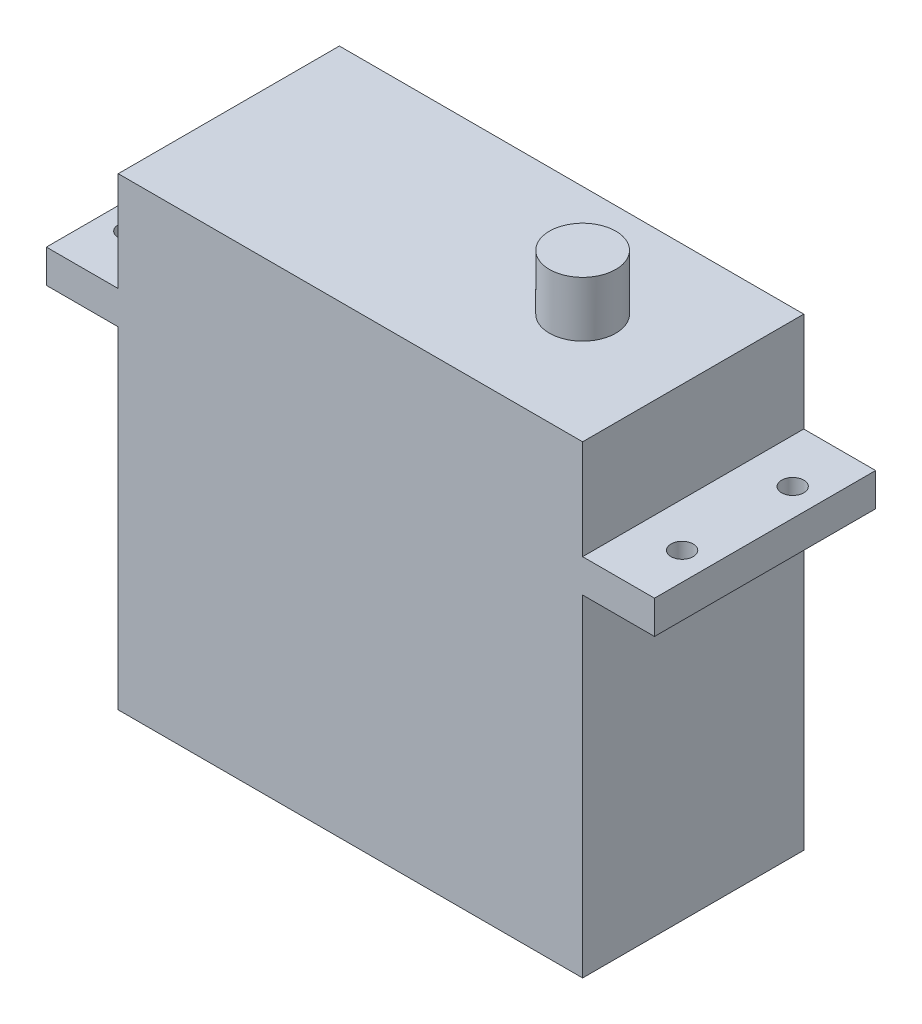
ISO-10303-21;
HEADER;
FILE_DESCRIPTION(('STEP AP214'),'2;1');
FILE_NAME('part.step','',(''),(''),'','','');
FILE_SCHEMA(('AUTOMOTIVE_DESIGN { 1 0 10303 214 1 1 1 1 }'));
ENDSEC;
DATA;
#1=APPLICATION_CONTEXT('core data for automotive mechanical design processes');
#2=APPLICATION_PROTOCOL_DEFINITION('international standard','automotive_design',2000,#1);
#3=PRODUCT_CONTEXT('',#1,'mechanical');
#4=PRODUCT('Part','Part','',(#3));
#5=PRODUCT_RELATED_PRODUCT_CATEGORY('part','',(#4));
#6=PRODUCT_DEFINITION_FORMATION('','',#4);
#7=PRODUCT_DEFINITION_CONTEXT('part definition',#1,'design');
#8=PRODUCT_DEFINITION('design','',#6,#7);
#9=PRODUCT_DEFINITION_SHAPE('','',#8);
#10=(LENGTH_UNIT() NAMED_UNIT(*) SI_UNIT(.MILLI.,.METRE.));
#11=(NAMED_UNIT(*) PLANE_ANGLE_UNIT() SI_UNIT($,.RADIAN.));
#12=(NAMED_UNIT(*) SI_UNIT($,.STERADIAN.) SOLID_ANGLE_UNIT());
#13=UNCERTAINTY_MEASURE_WITH_UNIT(LENGTH_MEASURE(1.E-05),#10,'distance_accuracy_value','');
#14=(GEOMETRIC_REPRESENTATION_CONTEXT(3) GLOBAL_UNCERTAINTY_ASSIGNED_CONTEXT((#13)) GLOBAL_UNIT_ASSIGNED_CONTEXT((#10,
#11,#12)) REPRESENTATION_CONTEXT('',''));
#15=CARTESIAN_POINT('',(0.,0.,0.));
#16=DIRECTION('',(0.,0.,1.));
#17=DIRECTION('',(1.,0.,0.));
#18=AXIS2_PLACEMENT_3D('',#15,#16,#17);
#19=CARTESIAN_POINT('',(0.,42.,-20.));
#20=DIRECTION('',(0.,-1.,0.));
#21=DIRECTION('',(0.,0.,-1.));
#22=AXIS2_PLACEMENT_3D('',#19,#20,#21);
#23=PLANE('',#22);
#24=DIRECTION('',(0.,0.,1.));
#25=VECTOR('',#24,1.);
#26=CARTESIAN_POINT('',(0.,42.,0.));
#27=LINE('',#26,#25);
#28=CARTESIAN_POINT('',(0.,42.,-20.));
#29=VERTEX_POINT('',#28);
#30=CARTESIAN_POINT('',(0.,42.,0.));
#31=VERTEX_POINT('',#30);
#32=EDGE_CURVE('E182',#29,#31,#27,.T.);
#33=ORIENTED_EDGE('',*,*,#32,.T.);
#34=DIRECTION('',(1.,0.,0.));
#35=VECTOR('',#34,1.);
#36=CARTESIAN_POINT('',(0.,42.,0.));
#37=LINE('',#36,#35);
#38=CARTESIAN_POINT('',(42.,42.,0.));
#39=VERTEX_POINT('',#38);
#40=EDGE_CURVE('E185',#31,#39,#37,.T.);
#41=ORIENTED_EDGE('',*,*,#40,.T.);
#42=DIRECTION('',(0.,0.,-1.));
#43=VECTOR('',#42,1.);
#44=CARTESIAN_POINT('',(42.,42.,0.));
#45=LINE('',#44,#43);
#46=CARTESIAN_POINT('',(42.,42.,-20.));
#47=VERTEX_POINT('',#46);
#48=EDGE_CURVE('E188',#39,#47,#45,.T.);
#49=ORIENTED_EDGE('',*,*,#48,.T.);
#50=DIRECTION('',(-1.,0.,0.));
#51=VECTOR('',#50,1.);
#52=CARTESIAN_POINT('',(0.,42.,-20.));
#53=LINE('',#52,#51);
#54=EDGE_CURVE('E190',#47,#29,#53,.T.);
#55=ORIENTED_EDGE('',*,*,#54,.T.);
#56=EDGE_LOOP('',(#33,#41,#49,#55));
#57=FACE_BOUND('',#56,.T.);
#58=CARTESIAN_POINT('',(32.,42.,-10.));
#59=DIRECTION('',(0.,-1.,0.));
#60=DIRECTION('',(0.,0.,-1.));
#61=AXIS2_PLACEMENT_3D('',#58,#59,#60);
#62=CIRCLE('',#61,3.);
#63=CARTESIAN_POINT('',(32.,42.,-13.));
#64=VERTEX_POINT('',#63);
#65=EDGE_CURVE('E11',#64,#64,#62,.F.);
#66=ORIENTED_EDGE('',*,*,#65,.F.);
#67=EDGE_LOOP('',(#66));
#68=FACE_BOUND('',#67,.T.);
#69=ADVANCED_FACE('F34',(#57,#68),#23,.F.);
#70=CARTESIAN_POINT('',(0.,42.,0.));
#71=DIRECTION('',(1.,0.,0.));
#72=DIRECTION('',(0.,0.,-1.));
#73=AXIS2_PLACEMENT_3D('',#70,#71,#72);
#74=PLANE('',#73);
#75=DIRECTION('',(0.,-1.,0.));
#76=VECTOR('',#75,1.);
#77=CARTESIAN_POINT('',(0.,42.,-20.));
#78=LINE('',#77,#76);
#79=CARTESIAN_POINT('',(0.,33.,-20.));
#80=VERTEX_POINT('',#79);
#81=EDGE_CURVE('E202',#29,#80,#78,.T.);
#82=ORIENTED_EDGE('',*,*,#81,.T.);
#83=DIRECTION('',(0.,0.,1.));
#84=VECTOR('',#83,1.);
#85=CARTESIAN_POINT('',(0.,33.,0.));
#86=LINE('',#85,#84);
#87=CARTESIAN_POINT('',(0.,33.,0.));
#88=VERTEX_POINT('',#87);
#89=EDGE_CURVE('E57',#80,#88,#86,.T.);
#90=ORIENTED_EDGE('',*,*,#89,.T.);
#91=DIRECTION('',(0.,-1.,0.));
#92=VECTOR('',#91,1.);
#93=CARTESIAN_POINT('',(0.,42.,0.));
#94=LINE('',#93,#92);
#95=EDGE_CURVE('E42',#31,#88,#94,.T.);
#96=ORIENTED_EDGE('',*,*,#95,.F.);
#97=ORIENTED_EDGE('',*,*,#32,.F.);
#98=EDGE_LOOP('',(#82,#90,#96,#97));
#99=FACE_BOUND('',#98,.T.);
#100=ADVANCED_FACE('F272',(#99),#74,.F.);
#101=CARTESIAN_POINT('',(42.,42.,0.));
#102=DIRECTION('',(-1.,0.,0.));
#103=DIRECTION('',(0.,0.,1.));
#104=AXIS2_PLACEMENT_3D('',#101,#102,#103);
#105=PLANE('',#104);
#106=DIRECTION('',(0.,-1.,0.));
#107=VECTOR('',#106,1.);
#108=CARTESIAN_POINT('',(42.,42.,0.));
#109=LINE('',#108,#107);
#110=CARTESIAN_POINT('',(42.,33.,0.));
#111=VERTEX_POINT('',#110);
#112=EDGE_CURVE('E209',#39,#111,#109,.T.);
#113=ORIENTED_EDGE('',*,*,#112,.T.);
#114=DIRECTION('',(0.,0.,-1.));
#115=VECTOR('',#114,1.);
#116=CARTESIAN_POINT('',(42.,33.,0.));
#117=LINE('',#116,#115);
#118=CARTESIAN_POINT('',(42.,33.,-20.));
#119=VERTEX_POINT('',#118);
#120=EDGE_CURVE('E177',#111,#119,#117,.T.);
#121=ORIENTED_EDGE('',*,*,#120,.T.);
#122=DIRECTION('',(0.,-1.,0.));
#123=VECTOR('',#122,1.);
#124=CARTESIAN_POINT('',(42.,42.,-20.));
#125=LINE('',#124,#123);
#126=EDGE_CURVE('E205',#47,#119,#125,.T.);
#127=ORIENTED_EDGE('',*,*,#126,.F.);
#128=ORIENTED_EDGE('',*,*,#48,.F.);
#129=EDGE_LOOP('',(#113,#121,#127,#128));
#130=FACE_BOUND('',#129,.T.);
#131=ADVANCED_FACE('F251',(#130),#105,.F.);
#132=CARTESIAN_POINT('',(0.,30.,0.));
#133=VERTEX_POINT('',#132);
#134=CARTESIAN_POINT('',(0.,0.,0.));
#135=VERTEX_POINT('',#134);
#136=EDGE_CURVE('E49',#133,#135,#94,.T.);
#137=ORIENTED_EDGE('',*,*,#136,.F.);
#138=DIRECTION('',(0.,0.,-1.));
#139=VECTOR('',#138,1.);
#140=CARTESIAN_POINT('',(0.,30.,0.));
#141=LINE('',#140,#139);
#142=CARTESIAN_POINT('',(0.,30.,-20.));
#143=VERTEX_POINT('',#142);
#144=EDGE_CURVE('E141',#133,#143,#141,.T.);
#145=ORIENTED_EDGE('',*,*,#144,.T.);
#146=CARTESIAN_POINT('',(0.,0.,-20.));
#147=VERTEX_POINT('',#146);
#148=EDGE_CURVE('E192',#143,#147,#78,.T.);
#149=ORIENTED_EDGE('',*,*,#148,.T.);
#150=DIRECTION('',(0.,0.,1.));
#151=VECTOR('',#150,1.);
#152=CARTESIAN_POINT('',(0.,0.,0.));
#153=LINE('',#152,#151);
#154=EDGE_CURVE('E181',#147,#135,#153,.T.);
#155=ORIENTED_EDGE('',*,*,#154,.T.);
#156=EDGE_LOOP('',(#137,#145,#149,#155));
#157=FACE_BOUND('',#156,.T.);
#158=ADVANCED_FACE('F36',(#157),#74,.F.);
#159=CARTESIAN_POINT('',(0.,42.,0.));
#160=DIRECTION('',(0.,0.,-1.));
#161=DIRECTION('',(-1.,0.,0.));
#162=AXIS2_PLACEMENT_3D('',#159,#160,#161);
#163=PLANE('',#162);
#164=CARTESIAN_POINT('',(42.,30.,0.));
#165=VERTEX_POINT('',#164);
#166=CARTESIAN_POINT('',(42.,0.,0.));
#167=VERTEX_POINT('',#166);
#168=EDGE_CURVE('E208',#165,#167,#109,.T.);
#169=ORIENTED_EDGE('',*,*,#168,.F.);
#170=DIRECTION('',(1.,0.,0.));
#171=VECTOR('',#170,1.);
#172=CARTESIAN_POINT('',(-6.5,30.,0.));
#173=LINE('',#172,#171);
#174=CARTESIAN_POINT('',(48.5,30.,0.));
#175=VERTEX_POINT('',#174);
#176=EDGE_CURVE('E144',#165,#175,#173,.T.);
#177=ORIENTED_EDGE('',*,*,#176,.T.);
#178=DIRECTION('',(0.,1.,0.));
#179=VECTOR('',#178,1.);
#180=CARTESIAN_POINT('',(48.5,30.,0.));
#181=LINE('',#180,#179);
#182=CARTESIAN_POINT('',(48.5,33.,0.));
#183=VERTEX_POINT('',#182);
#184=EDGE_CURVE('E143',#175,#183,#181,.T.);
#185=ORIENTED_EDGE('',*,*,#184,.T.);
#186=DIRECTION('',(-1.,0.,0.));
#187=VECTOR('',#186,1.);
#188=CARTESIAN_POINT('',(-6.5,33.,0.));
#189=LINE('',#188,#187);
#190=EDGE_CURVE('E136',#183,#111,#189,.T.);
#191=ORIENTED_EDGE('',*,*,#190,.T.);
#192=ORIENTED_EDGE('',*,*,#112,.F.);
#193=ORIENTED_EDGE('',*,*,#40,.F.);
#194=ORIENTED_EDGE('',*,*,#95,.T.);
#195=CARTESIAN_POINT('',(-6.5,33.,0.));
#196=VERTEX_POINT('',#195);
#197=EDGE_CURVE('E149',#88,#196,#189,.T.);
#198=ORIENTED_EDGE('',*,*,#197,.T.);
#199=DIRECTION('',(0.,-1.,0.));
#200=VECTOR('',#199,1.);
#201=CARTESIAN_POINT('',(-6.5,30.,0.));
#202=LINE('',#201,#200);
#203=CARTESIAN_POINT('',(-6.5,30.,0.));
#204=VERTEX_POINT('',#203);
#205=EDGE_CURVE('E131',#196,#204,#202,.T.);
#206=ORIENTED_EDGE('',*,*,#205,.T.);
#207=EDGE_CURVE('E139',#204,#133,#173,.T.);
#208=ORIENTED_EDGE('',*,*,#207,.T.);
#209=ORIENTED_EDGE('',*,*,#136,.T.);
#210=DIRECTION('',(1.,0.,0.));
#211=VECTOR('',#210,1.);
#212=CARTESIAN_POINT('',(0.,0.,0.));
#213=LINE('',#212,#211);
#214=EDGE_CURVE('E194',#135,#167,#213,.T.);
#215=ORIENTED_EDGE('',*,*,#214,.T.);
#216=EDGE_LOOP('',(#169,#177,#185,#191,#192,#193,#194,#198,#206,#208,#209,#215));
#217=FACE_BOUND('',#216,.T.);
#218=ADVANCED_FACE('F147',(#217),#163,.F.);
#219=CARTESIAN_POINT('',(42.,30.,-20.));
#220=VERTEX_POINT('',#219);
#221=CARTESIAN_POINT('',(42.,0.,-20.));
#222=VERTEX_POINT('',#221);
#223=EDGE_CURVE('E204',#220,#222,#125,.T.);
#224=ORIENTED_EDGE('',*,*,#223,.F.);
#225=DIRECTION('',(0.,0.,1.));
#226=VECTOR('',#225,1.);
#227=CARTESIAN_POINT('',(42.,30.,0.));
#228=LINE('',#227,#226);
#229=EDGE_CURVE('E172',#220,#165,#228,.T.);
#230=ORIENTED_EDGE('',*,*,#229,.T.);
#231=ORIENTED_EDGE('',*,*,#168,.T.);
#232=DIRECTION('',(0.,0.,-1.));
#233=VECTOR('',#232,1.);
#234=CARTESIAN_POINT('',(42.,0.,0.));
#235=LINE('',#234,#233);
#236=EDGE_CURVE('E197',#167,#222,#235,.T.);
#237=ORIENTED_EDGE('',*,*,#236,.T.);
#238=EDGE_LOOP('',(#224,#230,#231,#237));
#239=FACE_BOUND('',#238,.T.);
#240=ADVANCED_FACE('F285',(#239),#105,.F.);
#241=CARTESIAN_POINT('',(0.,42.,-20.));
#242=DIRECTION('',(0.,0.,1.));
#243=DIRECTION('',(1.,0.,0.));
#244=AXIS2_PLACEMENT_3D('',#241,#242,#243);
#245=PLANE('',#244);
#246=ORIENTED_EDGE('',*,*,#148,.F.);
#247=DIRECTION('',(-1.,0.,0.));
#248=VECTOR('',#247,1.);
#249=CARTESIAN_POINT('',(-6.5,30.,-20.));
#250=LINE('',#249,#248);
#251=CARTESIAN_POINT('',(-6.5,30.,-20.));
#252=VERTEX_POINT('',#251);
#253=EDGE_CURVE('E173',#143,#252,#250,.T.);
#254=ORIENTED_EDGE('',*,*,#253,.T.);
#255=DIRECTION('',(0.,1.,0.));
#256=VECTOR('',#255,1.);
#257=CARTESIAN_POINT('',(-6.5,30.,-20.));
#258=LINE('',#257,#256);
#259=CARTESIAN_POINT('',(-6.5,33.,-20.));
#260=VERTEX_POINT('',#259);
#261=EDGE_CURVE('E132',#252,#260,#258,.T.);
#262=ORIENTED_EDGE('',*,*,#261,.T.);
#263=DIRECTION('',(1.,0.,0.));
#264=VECTOR('',#263,1.);
#265=CARTESIAN_POINT('',(-6.5,33.,-20.));
#266=LINE('',#265,#264);
#267=EDGE_CURVE('E230',#260,#80,#266,.T.);
#268=ORIENTED_EDGE('',*,*,#267,.T.);
#269=ORIENTED_EDGE('',*,*,#81,.F.);
#270=ORIENTED_EDGE('',*,*,#54,.F.);
#271=ORIENTED_EDGE('',*,*,#126,.T.);
#272=CARTESIAN_POINT('',(48.5,33.,-20.));
#273=VERTEX_POINT('',#272);
#274=EDGE_CURVE('E229',#119,#273,#266,.T.);
#275=ORIENTED_EDGE('',*,*,#274,.T.);
#276=DIRECTION('',(0.,-1.,0.));
#277=VECTOR('',#276,1.);
#278=CARTESIAN_POINT('',(48.5,30.,-20.));
#279=LINE('',#278,#277);
#280=CARTESIAN_POINT('',(48.5,30.,-20.));
#281=VERTEX_POINT('',#280);
#282=EDGE_CURVE('E165',#273,#281,#279,.T.);
#283=ORIENTED_EDGE('',*,*,#282,.T.);
#284=EDGE_CURVE('E170',#281,#220,#250,.T.);
#285=ORIENTED_EDGE('',*,*,#284,.T.);
#286=ORIENTED_EDGE('',*,*,#223,.T.);
#287=DIRECTION('',(-1.,0.,0.));
#288=VECTOR('',#287,1.);
#289=CARTESIAN_POINT('',(0.,0.,-20.));
#290=LINE('',#289,#288);
#291=EDGE_CURVE('E186',#222,#147,#290,.T.);
#292=ORIENTED_EDGE('',*,*,#291,.T.);
#293=EDGE_LOOP('',(#246,#254,#262,#268,#269,#270,#271,#275,#283,#285,#286,#292));
#294=FACE_BOUND('',#293,.T.);
#295=ADVANCED_FACE('F236',(#294),#245,.F.);
#296=CARTESIAN_POINT('',(0.,0.,-20.));
#297=DIRECTION('',(0.,-1.,0.));
#298=DIRECTION('',(0.,0.,-1.));
#299=AXIS2_PLACEMENT_3D('',#296,#297,#298);
#300=PLANE('',#299);
#301=ORIENTED_EDGE('',*,*,#154,.F.);
#302=ORIENTED_EDGE('',*,*,#291,.F.);
#303=ORIENTED_EDGE('',*,*,#236,.F.);
#304=ORIENTED_EDGE('',*,*,#214,.F.);
#305=EDGE_LOOP('',(#301,#302,#303,#304));
#306=FACE_BOUND('',#305,.T.);
#307=ADVANCED_FACE('F279',(#306),#300,.T.);
#308=CARTESIAN_POINT('',(48.5,30.,-75.0817574156816));
#309=DIRECTION('',(1.,0.,0.));
#310=DIRECTION('',(0.,0.,-1.));
#311=AXIS2_PLACEMENT_3D('',#308,#309,#310);
#312=PLANE('',#311);
#313=ORIENTED_EDGE('',*,*,#282,.F.);
#314=DIRECTION('',(0.,0.,1.));
#315=VECTOR('',#314,1.);
#316=CARTESIAN_POINT('',(48.5,33.,-75.0817574156816));
#317=LINE('',#316,#315);
#318=EDGE_CURVE('E166',#273,#183,#317,.T.);
#319=ORIENTED_EDGE('',*,*,#318,.T.);
#320=ORIENTED_EDGE('',*,*,#184,.F.);
#321=DIRECTION('',(0.,0.,1.));
#322=VECTOR('',#321,1.);
#323=CARTESIAN_POINT('',(48.5,30.,-75.0817574156816));
#324=LINE('',#323,#322);
#325=EDGE_CURVE('E135',#281,#175,#324,.T.);
#326=ORIENTED_EDGE('',*,*,#325,.F.);
#327=EDGE_LOOP('',(#313,#319,#320,#326));
#328=FACE_BOUND('',#327,.T.);
#329=ADVANCED_FACE('F243',(#328),#312,.T.);
#330=CARTESIAN_POINT('',(-6.5,30.,-75.0817574156816));
#331=DIRECTION('',(0.,-1.,0.));
#332=DIRECTION('',(0.,0.,-1.));
#333=AXIS2_PLACEMENT_3D('',#330,#331,#332);
#334=PLANE('',#333);
#335=CARTESIAN_POINT('',(46.,30.,-5.));
#336=DIRECTION('',(0.,-1.,0.));
#337=DIRECTION('',(0.,0.,-1.));
#338=AXIS2_PLACEMENT_3D('',#335,#336,#337);
#339=CIRCLE('',#338,0.999999999999998);
#340=CARTESIAN_POINT('',(46.,30.,-4.));
#341=VERTEX_POINT('',#340);
#342=EDGE_CURVE('E413',#341,#341,#339,.T.);
#343=ORIENTED_EDGE('',*,*,#342,.F.);
#344=EDGE_LOOP('',(#343));
#345=FACE_BOUND('',#344,.T.);
#346=CARTESIAN_POINT('',(46.,30.,-15.));
#347=DIRECTION('',(0.,-1.,0.));
#348=DIRECTION('',(0.,0.,-1.));
#349=AXIS2_PLACEMENT_3D('',#346,#347,#348);
#350=CIRCLE('',#349,0.999999999999998);
#351=CARTESIAN_POINT('',(46.,30.,-14.));
#352=VERTEX_POINT('',#351);
#353=EDGE_CURVE('E220',#352,#352,#350,.T.);
#354=ORIENTED_EDGE('',*,*,#353,.F.);
#355=EDGE_LOOP('',(#354));
#356=FACE_BOUND('',#355,.T.);
#357=ORIENTED_EDGE('',*,*,#229,.F.);
#358=ORIENTED_EDGE('',*,*,#284,.F.);
#359=ORIENTED_EDGE('',*,*,#325,.T.);
#360=ORIENTED_EDGE('',*,*,#176,.F.);
#361=EDGE_LOOP('',(#357,#358,#359,#360));
#362=FACE_BOUND('',#361,.T.);
#363=ADVANCED_FACE('F266',(#345,#356,#362),#334,.T.);
#364=CARTESIAN_POINT('',(-6.5,33.,-75.0817574156816));
#365=DIRECTION('',(0.,1.,0.));
#366=DIRECTION('',(0.,0.,1.));
#367=AXIS2_PLACEMENT_3D('',#364,#365,#366);
#368=PLANE('',#367);
#369=CARTESIAN_POINT('',(46.,33.,-5.));
#370=DIRECTION('',(0.,1.,0.));
#371=DIRECTION('',(0.,0.,1.));
#372=AXIS2_PLACEMENT_3D('',#369,#370,#371);
#373=CIRCLE('',#372,0.999999999999998);
#374=CARTESIAN_POINT('',(46.,33.,-4.));
#375=VERTEX_POINT('',#374);
#376=EDGE_CURVE('E410',#375,#375,#373,.T.);
#377=ORIENTED_EDGE('',*,*,#376,.F.);
#378=EDGE_LOOP('',(#377));
#379=FACE_BOUND('',#378,.T.);
#380=CARTESIAN_POINT('',(46.,33.,-15.));
#381=DIRECTION('',(0.,1.,0.));
#382=DIRECTION('',(0.,0.,1.));
#383=AXIS2_PLACEMENT_3D('',#380,#381,#382);
#384=CIRCLE('',#383,0.999999999999998);
#385=CARTESIAN_POINT('',(46.,33.,-14.));
#386=VERTEX_POINT('',#385);
#387=EDGE_CURVE('E225',#386,#386,#384,.T.);
#388=ORIENTED_EDGE('',*,*,#387,.F.);
#389=EDGE_LOOP('',(#388));
#390=FACE_BOUND('',#389,.T.);
#391=ORIENTED_EDGE('',*,*,#120,.F.);
#392=ORIENTED_EDGE('',*,*,#190,.F.);
#393=ORIENTED_EDGE('',*,*,#318,.F.);
#394=ORIENTED_EDGE('',*,*,#274,.F.);
#395=EDGE_LOOP('',(#391,#392,#393,#394));
#396=FACE_BOUND('',#395,.T.);
#397=ADVANCED_FACE('F247',(#379,#390,#396),#368,.T.);
#398=CARTESIAN_POINT('',(-4.,33.,-5.));
#399=DIRECTION('',(0.,1.,0.));
#400=DIRECTION('',(0.,0.,1.));
#401=AXIS2_PLACEMENT_3D('',#398,#399,#400);
#402=CIRCLE('',#401,1.);
#403=CARTESIAN_POINT('',(-4.,33.,-4.));
#404=VERTEX_POINT('',#403);
#405=EDGE_CURVE('E214',#404,#404,#402,.T.);
#406=ORIENTED_EDGE('',*,*,#405,.F.);
#407=EDGE_LOOP('',(#406));
#408=FACE_BOUND('',#407,.T.);
#409=CARTESIAN_POINT('',(-4.,33.,-15.));
#410=DIRECTION('',(0.,1.,0.));
#411=DIRECTION('',(0.,0.,1.));
#412=AXIS2_PLACEMENT_3D('',#409,#410,#411);
#413=CIRCLE('',#412,1.);
#414=CARTESIAN_POINT('',(-4.,33.,-14.));
#415=VERTEX_POINT('',#414);
#416=EDGE_CURVE('E154',#415,#415,#413,.T.);
#417=ORIENTED_EDGE('',*,*,#416,.F.);
#418=EDGE_LOOP('',(#417));
#419=FACE_BOUND('',#418,.T.);
#420=ORIENTED_EDGE('',*,*,#89,.F.);
#421=ORIENTED_EDGE('',*,*,#267,.F.);
#422=DIRECTION('',(0.,0.,1.));
#423=VECTOR('',#422,1.);
#424=CARTESIAN_POINT('',(-6.5,33.,-75.0817574156816));
#425=LINE('',#424,#423);
#426=EDGE_CURVE('E163',#260,#196,#425,.T.);
#427=ORIENTED_EDGE('',*,*,#426,.T.);
#428=ORIENTED_EDGE('',*,*,#197,.F.);
#429=EDGE_LOOP('',(#420,#421,#427,#428));
#430=FACE_BOUND('',#429,.T.);
#431=ADVANCED_FACE('F256',(#408,#419,#430),#368,.T.);
#432=CARTESIAN_POINT('',(-4.,30.,-5.));
#433=DIRECTION('',(0.,-1.,0.));
#434=DIRECTION('',(0.,0.,-1.));
#435=AXIS2_PLACEMENT_3D('',#432,#433,#434);
#436=CIRCLE('',#435,1.);
#437=CARTESIAN_POINT('',(-4.,30.,-4.));
#438=VERTEX_POINT('',#437);
#439=EDGE_CURVE('E212',#438,#438,#436,.T.);
#440=ORIENTED_EDGE('',*,*,#439,.F.);
#441=EDGE_LOOP('',(#440));
#442=FACE_BOUND('',#441,.T.);
#443=CARTESIAN_POINT('',(-4.,30.,-15.));
#444=DIRECTION('',(0.,-1.,0.));
#445=DIRECTION('',(0.,0.,-1.));
#446=AXIS2_PLACEMENT_3D('',#443,#444,#445);
#447=CIRCLE('',#446,1.);
#448=CARTESIAN_POINT('',(-4.,30.,-14.));
#449=VERTEX_POINT('',#448);
#450=EDGE_CURVE('E151',#449,#449,#447,.T.);
#451=ORIENTED_EDGE('',*,*,#450,.F.);
#452=EDGE_LOOP('',(#451));
#453=FACE_BOUND('',#452,.T.);
#454=ORIENTED_EDGE('',*,*,#144,.F.);
#455=ORIENTED_EDGE('',*,*,#207,.F.);
#456=DIRECTION('',(0.,0.,1.));
#457=VECTOR('',#456,1.);
#458=CARTESIAN_POINT('',(-6.5,30.,-75.0817574156816));
#459=LINE('',#458,#457);
#460=EDGE_CURVE('E126',#252,#204,#459,.T.);
#461=ORIENTED_EDGE('',*,*,#460,.F.);
#462=ORIENTED_EDGE('',*,*,#253,.F.);
#463=EDGE_LOOP('',(#454,#455,#461,#462));
#464=FACE_BOUND('',#463,.T.);
#465=ADVANCED_FACE('F140',(#442,#453,#464),#334,.T.);
#466=CARTESIAN_POINT('',(-6.5,30.,-75.0817574156816));
#467=DIRECTION('',(-1.,0.,0.));
#468=DIRECTION('',(0.,0.,1.));
#469=AXIS2_PLACEMENT_3D('',#466,#467,#468);
#470=PLANE('',#469);
#471=ORIENTED_EDGE('',*,*,#261,.F.);
#472=ORIENTED_EDGE('',*,*,#460,.T.);
#473=ORIENTED_EDGE('',*,*,#205,.F.);
#474=ORIENTED_EDGE('',*,*,#426,.F.);
#475=EDGE_LOOP('',(#471,#472,#473,#474));
#476=FACE_BOUND('',#475,.T.);
#477=ADVANCED_FACE('F128',(#476),#470,.T.);
#478=CARTESIAN_POINT('',(-4.,-9.,-15.));
#479=DIRECTION('',(0.,1.,0.));
#480=DIRECTION('',(0.,0.,1.));
#481=AXIS2_PLACEMENT_3D('',#478,#479,#480);
#482=CYLINDRICAL_SURFACE('',#481,1.);
#483=CARTESIAN_POINT('',(-4.,30.,-14.));
#484=CARTESIAN_POINT('',(-4.,30.03125,-14.));
#485=CARTESIAN_POINT('',(-4.,30.0625,-14.));
#486=CARTESIAN_POINT('',(-4.,30.125,-14.));
#487=CARTESIAN_POINT('',(-4.,30.15625,-14.));
#488=CARTESIAN_POINT('',(-4.,30.21875,-14.));
#489=CARTESIAN_POINT('',(-4.,30.25,-14.));
#490=CARTESIAN_POINT('',(-4.,30.3125,-14.));
#491=CARTESIAN_POINT('',(-4.,30.34375,-14.));
#492=CARTESIAN_POINT('',(-4.,30.40625,-14.));
#493=CARTESIAN_POINT('',(-4.,30.4375,-14.));
#494=CARTESIAN_POINT('',(-4.,30.5,-14.));
#495=CARTESIAN_POINT('',(-4.,30.53125,-14.));
#496=CARTESIAN_POINT('',(-4.,30.59375,-14.));
#497=CARTESIAN_POINT('',(-4.,30.625,-14.));
#498=CARTESIAN_POINT('',(-4.,30.6875,-14.));
#499=CARTESIAN_POINT('',(-4.,30.71875,-14.));
#500=CARTESIAN_POINT('',(-4.,30.78125,-14.));
#501=CARTESIAN_POINT('',(-4.,30.8125,-14.));
#502=CARTESIAN_POINT('',(-4.,30.875,-14.));
#503=CARTESIAN_POINT('',(-4.,30.90625,-14.));
#504=CARTESIAN_POINT('',(-4.,30.96875,-14.));
#505=CARTESIAN_POINT('',(-4.,31.,-14.));
#506=CARTESIAN_POINT('',(-4.,31.0625,-14.));
#507=CARTESIAN_POINT('',(-4.,31.09375,-14.));
#508=CARTESIAN_POINT('',(-4.,31.15625,-14.));
#509=CARTESIAN_POINT('',(-4.,31.1875,-14.));
#510=CARTESIAN_POINT('',(-4.,31.25,-14.));
#511=CARTESIAN_POINT('',(-4.,31.28125,-14.));
#512=CARTESIAN_POINT('',(-4.,31.34375,-14.));
#513=CARTESIAN_POINT('',(-4.,31.375,-14.));
#514=CARTESIAN_POINT('',(-4.,31.4375,-14.));
#515=CARTESIAN_POINT('',(-4.,31.46875,-14.));
#516=CARTESIAN_POINT('',(-4.,31.53125,-14.));
#517=CARTESIAN_POINT('',(-4.,31.5625,-14.));
#518=CARTESIAN_POINT('',(-4.,31.625,-14.));
#519=CARTESIAN_POINT('',(-4.,31.65625,-14.));
#520=CARTESIAN_POINT('',(-4.,31.71875,-14.));
#521=CARTESIAN_POINT('',(-4.,31.75,-14.));
#522=CARTESIAN_POINT('',(-4.,31.8125,-14.));
#523=CARTESIAN_POINT('',(-4.,31.84375,-14.));
#524=CARTESIAN_POINT('',(-4.,31.90625,-14.));
#525=CARTESIAN_POINT('',(-4.,31.9375,-14.));
#526=CARTESIAN_POINT('',(-4.,32.,-14.));
#527=CARTESIAN_POINT('',(-4.,32.03125,-14.));
#528=CARTESIAN_POINT('',(-4.,32.09375,-14.));
#529=CARTESIAN_POINT('',(-4.,32.125,-14.));
#530=CARTESIAN_POINT('',(-4.,32.1875,-14.));
#531=CARTESIAN_POINT('',(-4.,32.21875,-14.));
#532=CARTESIAN_POINT('',(-4.,32.28125,-14.));
#533=CARTESIAN_POINT('',(-4.,32.3125,-14.));
#534=CARTESIAN_POINT('',(-4.,32.375,-14.));
#535=CARTESIAN_POINT('',(-4.,32.40625,-14.));
#536=CARTESIAN_POINT('',(-4.,32.46875,-14.));
#537=CARTESIAN_POINT('',(-4.,32.5,-14.));
#538=CARTESIAN_POINT('',(-4.,32.5625,-14.));
#539=CARTESIAN_POINT('',(-4.,32.59375,-14.));
#540=CARTESIAN_POINT('',(-4.,32.65625,-14.));
#541=CARTESIAN_POINT('',(-4.,32.6875,-14.));
#542=CARTESIAN_POINT('',(-4.,32.75,-14.));
#543=CARTESIAN_POINT('',(-4.,32.78125,-14.));
#544=CARTESIAN_POINT('',(-4.,32.84375,-14.));
#545=CARTESIAN_POINT('',(-4.,32.875,-14.));
#546=CARTESIAN_POINT('',(-4.,32.9375,-14.));
#547=CARTESIAN_POINT('',(-4.,32.96875,-14.));
#548=CARTESIAN_POINT('',(-4.,33.,-14.));
#549=B_SPLINE_CURVE_WITH_KNOTS('',3,(#483,#484,#485,#486,#487,#488,#489,#490,#491,#492,#493,
#494,#495,#496,#497,#498,#499,#500,#501,#502,#503,#504,#505,#506,#507,#508,#509,#510,#511,#512,
#513,#514,#515,#516,#517,#518,#519,#520,#521,#522,#523,#524,#525,#526,#527,#528,#529,#530,#531,
#532,#533,#534,#535,#536,#537,#538,#539,#540,#541,#542,#543,#544,#545,#546,#547,#548),
.UNSPECIFIED.,.F.,.F.,(4,2,2,2,2,2,2,2,2,2,2,2,2,2,2,2,2,2,2,2,2,2,2,2,2,2,2,2,2,2,2,2,4),(0.,
0.0937500000000036,0.1875,0.281249999999997,0.375,0.468750000000004,0.5625,0.656249999999997,
0.750000000000001,0.843750000000004,0.937500000000001,1.03125,1.125,1.21875,1.3125,1.40625,1.5,
1.59375,1.6875,1.78125,1.875,1.96875000000001,2.0625,2.15625,2.25,2.34375000000001,2.4375,
2.53125,2.625,2.71875000000001,2.8125,2.90625,3.),.UNSPECIFIED.);
#550=EDGE_CURVE('BSEAM346',#449,#415,#549,.T.);
#551=ORIENTED_EDGE('',*,*,#450,.T.);
#552=ORIENTED_EDGE('',*,*,#416,.T.);
#553=ORIENTED_EDGE('',*,*,#550,.T.);
#554=ORIENTED_EDGE('',*,*,#550,.F.);
#555=EDGE_LOOP('',(#551,#553,#552,#554));
#556=FACE_BOUND('',#555,.T.);
#557=ADVANCED_FACE('F346',(#556),#482,.F.);
#558=CARTESIAN_POINT('',(-4.,-9.,-5.));
#559=DIRECTION('',(0.,1.,0.));
#560=DIRECTION('',(0.,0.,1.));
#561=AXIS2_PLACEMENT_3D('',#558,#559,#560);
#562=CYLINDRICAL_SURFACE('',#561,1.);
#563=CARTESIAN_POINT('',(-4.,30.,-4.));
#564=CARTESIAN_POINT('',(-4.,30.03125,-4.));
#565=CARTESIAN_POINT('',(-4.,30.0625,-4.));
#566=CARTESIAN_POINT('',(-4.,30.125,-4.));
#567=CARTESIAN_POINT('',(-4.,30.15625,-4.));
#568=CARTESIAN_POINT('',(-4.,30.21875,-4.));
#569=CARTESIAN_POINT('',(-4.,30.25,-4.));
#570=CARTESIAN_POINT('',(-4.,30.3125,-4.));
#571=CARTESIAN_POINT('',(-4.,30.34375,-4.));
#572=CARTESIAN_POINT('',(-4.,30.40625,-4.));
#573=CARTESIAN_POINT('',(-4.,30.4375,-4.));
#574=CARTESIAN_POINT('',(-4.,30.5,-4.));
#575=CARTESIAN_POINT('',(-4.,30.53125,-4.));
#576=CARTESIAN_POINT('',(-4.,30.59375,-4.));
#577=CARTESIAN_POINT('',(-4.,30.625,-4.));
#578=CARTESIAN_POINT('',(-4.,30.6875,-4.));
#579=CARTESIAN_POINT('',(-4.,30.71875,-4.));
#580=CARTESIAN_POINT('',(-4.,30.78125,-4.));
#581=CARTESIAN_POINT('',(-4.,30.8125,-4.));
#582=CARTESIAN_POINT('',(-4.,30.875,-4.));
#583=CARTESIAN_POINT('',(-4.,30.90625,-4.));
#584=CARTESIAN_POINT('',(-4.,30.96875,-4.));
#585=CARTESIAN_POINT('',(-4.,31.,-4.));
#586=CARTESIAN_POINT('',(-4.,31.0625,-4.));
#587=CARTESIAN_POINT('',(-4.,31.09375,-4.));
#588=CARTESIAN_POINT('',(-4.,31.15625,-4.));
#589=CARTESIAN_POINT('',(-4.,31.1875,-4.));
#590=CARTESIAN_POINT('',(-4.,31.25,-4.));
#591=CARTESIAN_POINT('',(-4.,31.28125,-4.));
#592=CARTESIAN_POINT('',(-4.,31.34375,-4.));
#593=CARTESIAN_POINT('',(-4.,31.375,-4.));
#594=CARTESIAN_POINT('',(-4.,31.4375,-4.));
#595=CARTESIAN_POINT('',(-4.,31.46875,-4.));
#596=CARTESIAN_POINT('',(-4.,31.53125,-4.));
#597=CARTESIAN_POINT('',(-4.,31.5625,-4.));
#598=CARTESIAN_POINT('',(-4.,31.625,-4.));
#599=CARTESIAN_POINT('',(-4.,31.65625,-4.));
#600=CARTESIAN_POINT('',(-4.,31.71875,-4.));
#601=CARTESIAN_POINT('',(-4.,31.75,-4.));
#602=CARTESIAN_POINT('',(-4.,31.8125,-4.));
#603=CARTESIAN_POINT('',(-4.,31.84375,-4.));
#604=CARTESIAN_POINT('',(-4.,31.90625,-4.));
#605=CARTESIAN_POINT('',(-4.,31.9375,-4.));
#606=CARTESIAN_POINT('',(-4.,32.,-4.));
#607=CARTESIAN_POINT('',(-4.,32.03125,-4.));
#608=CARTESIAN_POINT('',(-4.,32.09375,-4.));
#609=CARTESIAN_POINT('',(-4.,32.125,-4.));
#610=CARTESIAN_POINT('',(-4.,32.1875,-4.));
#611=CARTESIAN_POINT('',(-4.,32.21875,-4.));
#612=CARTESIAN_POINT('',(-4.,32.28125,-4.));
#613=CARTESIAN_POINT('',(-4.,32.3125,-4.));
#614=CARTESIAN_POINT('',(-4.,32.375,-4.));
#615=CARTESIAN_POINT('',(-4.,32.40625,-4.));
#616=CARTESIAN_POINT('',(-4.,32.46875,-4.));
#617=CARTESIAN_POINT('',(-4.,32.5,-4.));
#618=CARTESIAN_POINT('',(-4.,32.5625,-4.));
#619=CARTESIAN_POINT('',(-4.,32.59375,-4.));
#620=CARTESIAN_POINT('',(-4.,32.65625,-4.));
#621=CARTESIAN_POINT('',(-4.,32.6875,-4.));
#622=CARTESIAN_POINT('',(-4.,32.75,-4.));
#623=CARTESIAN_POINT('',(-4.,32.78125,-4.));
#624=CARTESIAN_POINT('',(-4.,32.84375,-4.));
#625=CARTESIAN_POINT('',(-4.,32.875,-4.));
#626=CARTESIAN_POINT('',(-4.,32.9375,-4.));
#627=CARTESIAN_POINT('',(-4.,32.96875,-4.));
#628=CARTESIAN_POINT('',(-4.,33.,-4.));
#629=B_SPLINE_CURVE_WITH_KNOTS('',3,(#563,#564,#565,#566,#567,#568,#569,#570,#571,#572,#573,
#574,#575,#576,#577,#578,#579,#580,#581,#582,#583,#584,#585,#586,#587,#588,#589,#590,#591,#592,
#593,#594,#595,#596,#597,#598,#599,#600,#601,#602,#603,#604,#605,#606,#607,#608,#609,#610,#611,
#612,#613,#614,#615,#616,#617,#618,#619,#620,#621,#622,#623,#624,#625,#626,#627,#628),
.UNSPECIFIED.,.F.,.F.,(4,2,2,2,2,2,2,2,2,2,2,2,2,2,2,2,2,2,2,2,2,2,2,2,2,2,2,2,2,2,2,2,4),(0.,
0.0937500000000036,0.1875,0.281249999999997,0.375,0.468750000000004,0.5625,0.656249999999997,
0.750000000000001,0.843750000000004,0.937500000000001,1.03125,1.125,1.21875,1.3125,1.40625,1.5,
1.59375,1.6875,1.78125,1.875,1.96875000000001,2.0625,2.15625,2.25,2.34375000000001,2.4375,
2.53125,2.625,2.71875000000001,2.8125,2.90625,3.),.UNSPECIFIED.);
#630=EDGE_CURVE('BSEAM351',#438,#404,#629,.T.);
#631=ORIENTED_EDGE('',*,*,#439,.T.);
#632=ORIENTED_EDGE('',*,*,#405,.T.);
#633=ORIENTED_EDGE('',*,*,#630,.T.);
#634=ORIENTED_EDGE('',*,*,#630,.F.);
#635=EDGE_LOOP('',(#631,#633,#632,#634));
#636=FACE_BOUND('',#635,.T.);
#637=ADVANCED_FACE('F351',(#636),#562,.F.);
#638=CARTESIAN_POINT('',(46.,-9.,-15.));
#639=DIRECTION('',(0.,1.,0.));
#640=DIRECTION('',(0.,0.,1.));
#641=AXIS2_PLACEMENT_3D('',#638,#639,#640);
#642=CYLINDRICAL_SURFACE('',#641,0.999999999999998);
#643=CARTESIAN_POINT('',(46.,30.,-14.));
#644=CARTESIAN_POINT('',(46.,30.03125,-14.));
#645=CARTESIAN_POINT('',(46.,30.0625,-14.));
#646=CARTESIAN_POINT('',(46.,30.125,-14.));
#647=CARTESIAN_POINT('',(46.,30.15625,-14.));
#648=CARTESIAN_POINT('',(46.,30.21875,-14.));
#649=CARTESIAN_POINT('',(46.,30.25,-14.));
#650=CARTESIAN_POINT('',(46.,30.3125,-14.));
#651=CARTESIAN_POINT('',(46.,30.34375,-14.));
#652=CARTESIAN_POINT('',(46.,30.40625,-14.));
#653=CARTESIAN_POINT('',(46.,30.4375,-14.));
#654=CARTESIAN_POINT('',(46.,30.5,-14.));
#655=CARTESIAN_POINT('',(46.,30.53125,-14.));
#656=CARTESIAN_POINT('',(46.,30.59375,-14.));
#657=CARTESIAN_POINT('',(46.,30.625,-14.));
#658=CARTESIAN_POINT('',(46.,30.6875,-14.));
#659=CARTESIAN_POINT('',(46.,30.71875,-14.));
#660=CARTESIAN_POINT('',(46.,30.78125,-14.));
#661=CARTESIAN_POINT('',(46.,30.8125,-14.));
#662=CARTESIAN_POINT('',(46.,30.875,-14.));
#663=CARTESIAN_POINT('',(46.,30.90625,-14.));
#664=CARTESIAN_POINT('',(46.,30.96875,-14.));
#665=CARTESIAN_POINT('',(46.,31.,-14.));
#666=CARTESIAN_POINT('',(46.,31.0625,-14.));
#667=CARTESIAN_POINT('',(46.,31.09375,-14.));
#668=CARTESIAN_POINT('',(46.,31.15625,-14.));
#669=CARTESIAN_POINT('',(46.,31.1875,-14.));
#670=CARTESIAN_POINT('',(46.,31.25,-14.));
#671=CARTESIAN_POINT('',(46.,31.28125,-14.));
#672=CARTESIAN_POINT('',(46.,31.34375,-14.));
#673=CARTESIAN_POINT('',(46.,31.375,-14.));
#674=CARTESIAN_POINT('',(46.,31.4375,-14.));
#675=CARTESIAN_POINT('',(46.,31.46875,-14.));
#676=CARTESIAN_POINT('',(46.,31.53125,-14.));
#677=CARTESIAN_POINT('',(46.,31.5625,-14.));
#678=CARTESIAN_POINT('',(46.,31.625,-14.));
#679=CARTESIAN_POINT('',(46.,31.65625,-14.));
#680=CARTESIAN_POINT('',(46.,31.71875,-14.));
#681=CARTESIAN_POINT('',(46.,31.75,-14.));
#682=CARTESIAN_POINT('',(46.,31.8125,-14.));
#683=CARTESIAN_POINT('',(46.,31.84375,-14.));
#684=CARTESIAN_POINT('',(46.,31.90625,-14.));
#685=CARTESIAN_POINT('',(46.,31.9375,-14.));
#686=CARTESIAN_POINT('',(46.,32.,-14.));
#687=CARTESIAN_POINT('',(46.,32.03125,-14.));
#688=CARTESIAN_POINT('',(46.,32.09375,-14.));
#689=CARTESIAN_POINT('',(46.,32.125,-14.));
#690=CARTESIAN_POINT('',(46.,32.1875,-14.));
#691=CARTESIAN_POINT('',(46.,32.21875,-14.));
#692=CARTESIAN_POINT('',(46.,32.28125,-14.));
#693=CARTESIAN_POINT('',(46.,32.3125,-14.));
#694=CARTESIAN_POINT('',(46.,32.375,-14.));
#695=CARTESIAN_POINT('',(46.,32.40625,-14.));
#696=CARTESIAN_POINT('',(46.,32.46875,-14.));
#697=CARTESIAN_POINT('',(46.,32.5,-14.));
#698=CARTESIAN_POINT('',(46.,32.5625,-14.));
#699=CARTESIAN_POINT('',(46.,32.59375,-14.));
#700=CARTESIAN_POINT('',(46.,32.65625,-14.));
#701=CARTESIAN_POINT('',(46.,32.6875,-14.));
#702=CARTESIAN_POINT('',(46.,32.75,-14.));
#703=CARTESIAN_POINT('',(46.,32.78125,-14.));
#704=CARTESIAN_POINT('',(46.,32.84375,-14.));
#705=CARTESIAN_POINT('',(46.,32.875,-14.));
#706=CARTESIAN_POINT('',(46.,32.9375,-14.));
#707=CARTESIAN_POINT('',(46.,32.96875,-14.));
#708=CARTESIAN_POINT('',(46.,33.,-14.));
#709=B_SPLINE_CURVE_WITH_KNOTS('',3,(#643,#644,#645,#646,#647,#648,#649,#650,#651,#652,#653,
#654,#655,#656,#657,#658,#659,#660,#661,#662,#663,#664,#665,#666,#667,#668,#669,#670,#671,#672,
#673,#674,#675,#676,#677,#678,#679,#680,#681,#682,#683,#684,#685,#686,#687,#688,#689,#690,#691,
#692,#693,#694,#695,#696,#697,#698,#699,#700,#701,#702,#703,#704,#705,#706,#707,#708),
.UNSPECIFIED.,.F.,.F.,(4,2,2,2,2,2,2,2,2,2,2,2,2,2,2,2,2,2,2,2,2,2,2,2,2,2,2,2,2,2,2,2,4),(0.,
0.0937500000000036,0.1875,0.281249999999997,0.375,0.468750000000004,0.5625,0.656249999999997,
0.750000000000001,0.843750000000004,0.937500000000001,1.03125,1.125,1.21875,1.3125,1.40625,1.5,
1.59375,1.6875,1.78125,1.875,1.96875000000001,2.0625,2.15625,2.25,2.34375000000001,2.4375,
2.53125,2.625,2.71875000000001,2.8125,2.90625,3.),.UNSPECIFIED.);
#710=EDGE_CURVE('BSEAM360',#352,#386,#709,.T.);
#711=ORIENTED_EDGE('',*,*,#353,.T.);
#712=ORIENTED_EDGE('',*,*,#387,.T.);
#713=ORIENTED_EDGE('',*,*,#710,.T.);
#714=ORIENTED_EDGE('',*,*,#710,.F.);
#715=EDGE_LOOP('',(#711,#713,#712,#714));
#716=FACE_BOUND('',#715,.T.);
#717=ADVANCED_FACE('F360',(#716),#642,.F.);
#718=CARTESIAN_POINT('',(46.,-9.,-5.));
#719=DIRECTION('',(0.,1.,0.));
#720=DIRECTION('',(0.,0.,1.));
#721=AXIS2_PLACEMENT_3D('',#718,#719,#720);
#722=CYLINDRICAL_SURFACE('',#721,0.999999999999998);
#723=CARTESIAN_POINT('',(46.,30.,-4.));
#724=CARTESIAN_POINT('',(46.,30.03125,-4.));
#725=CARTESIAN_POINT('',(46.,30.0625,-4.));
#726=CARTESIAN_POINT('',(46.,30.125,-4.));
#727=CARTESIAN_POINT('',(46.,30.15625,-4.));
#728=CARTESIAN_POINT('',(46.,30.21875,-4.));
#729=CARTESIAN_POINT('',(46.,30.25,-4.));
#730=CARTESIAN_POINT('',(46.,30.3125,-4.));
#731=CARTESIAN_POINT('',(46.,30.34375,-4.));
#732=CARTESIAN_POINT('',(46.,30.40625,-4.));
#733=CARTESIAN_POINT('',(46.,30.4375,-4.));
#734=CARTESIAN_POINT('',(46.,30.5,-4.));
#735=CARTESIAN_POINT('',(46.,30.53125,-4.));
#736=CARTESIAN_POINT('',(46.,30.59375,-4.));
#737=CARTESIAN_POINT('',(46.,30.625,-4.));
#738=CARTESIAN_POINT('',(46.,30.6875,-4.));
#739=CARTESIAN_POINT('',(46.,30.71875,-4.));
#740=CARTESIAN_POINT('',(46.,30.78125,-4.));
#741=CARTESIAN_POINT('',(46.,30.8125,-4.));
#742=CARTESIAN_POINT('',(46.,30.875,-4.));
#743=CARTESIAN_POINT('',(46.,30.90625,-4.));
#744=CARTESIAN_POINT('',(46.,30.96875,-4.));
#745=CARTESIAN_POINT('',(46.,31.,-4.));
#746=CARTESIAN_POINT('',(46.,31.0625,-4.));
#747=CARTESIAN_POINT('',(46.,31.09375,-4.));
#748=CARTESIAN_POINT('',(46.,31.15625,-4.));
#749=CARTESIAN_POINT('',(46.,31.1875,-4.));
#750=CARTESIAN_POINT('',(46.,31.25,-4.));
#751=CARTESIAN_POINT('',(46.,31.28125,-4.));
#752=CARTESIAN_POINT('',(46.,31.34375,-4.));
#753=CARTESIAN_POINT('',(46.,31.375,-4.));
#754=CARTESIAN_POINT('',(46.,31.4375,-4.));
#755=CARTESIAN_POINT('',(46.,31.46875,-4.));
#756=CARTESIAN_POINT('',(46.,31.53125,-4.));
#757=CARTESIAN_POINT('',(46.,31.5625,-4.));
#758=CARTESIAN_POINT('',(46.,31.625,-4.));
#759=CARTESIAN_POINT('',(46.,31.65625,-4.));
#760=CARTESIAN_POINT('',(46.,31.71875,-4.));
#761=CARTESIAN_POINT('',(46.,31.75,-4.));
#762=CARTESIAN_POINT('',(46.,31.8125,-4.));
#763=CARTESIAN_POINT('',(46.,31.84375,-4.));
#764=CARTESIAN_POINT('',(46.,31.90625,-4.));
#765=CARTESIAN_POINT('',(46.,31.9375,-4.));
#766=CARTESIAN_POINT('',(46.,32.,-4.));
#767=CARTESIAN_POINT('',(46.,32.03125,-4.));
#768=CARTESIAN_POINT('',(46.,32.09375,-4.));
#769=CARTESIAN_POINT('',(46.,32.125,-4.));
#770=CARTESIAN_POINT('',(46.,32.1875,-4.));
#771=CARTESIAN_POINT('',(46.,32.21875,-4.));
#772=CARTESIAN_POINT('',(46.,32.28125,-4.));
#773=CARTESIAN_POINT('',(46.,32.3125,-4.));
#774=CARTESIAN_POINT('',(46.,32.375,-4.));
#775=CARTESIAN_POINT('',(46.,32.40625,-4.));
#776=CARTESIAN_POINT('',(46.,32.46875,-4.));
#777=CARTESIAN_POINT('',(46.,32.5,-4.));
#778=CARTESIAN_POINT('',(46.,32.5625,-4.));
#779=CARTESIAN_POINT('',(46.,32.59375,-4.));
#780=CARTESIAN_POINT('',(46.,32.65625,-4.));
#781=CARTESIAN_POINT('',(46.,32.6875,-4.));
#782=CARTESIAN_POINT('',(46.,32.75,-4.));
#783=CARTESIAN_POINT('',(46.,32.78125,-4.));
#784=CARTESIAN_POINT('',(46.,32.84375,-4.));
#785=CARTESIAN_POINT('',(46.,32.875,-4.));
#786=CARTESIAN_POINT('',(46.,32.9375,-4.));
#787=CARTESIAN_POINT('',(46.,32.96875,-4.));
#788=CARTESIAN_POINT('',(46.,33.,-4.));
#789=B_SPLINE_CURVE_WITH_KNOTS('',3,(#723,#724,#725,#726,#727,#728,#729,#730,#731,#732,#733,
#734,#735,#736,#737,#738,#739,#740,#741,#742,#743,#744,#745,#746,#747,#748,#749,#750,#751,#752,
#753,#754,#755,#756,#757,#758,#759,#760,#761,#762,#763,#764,#765,#766,#767,#768,#769,#770,#771,
#772,#773,#774,#775,#776,#777,#778,#779,#780,#781,#782,#783,#784,#785,#786,#787,#788),
.UNSPECIFIED.,.F.,.F.,(4,2,2,2,2,2,2,2,2,2,2,2,2,2,2,2,2,2,2,2,2,2,2,2,2,2,2,2,2,2,2,2,4),(0.,
0.0937500000000036,0.1875,0.281249999999997,0.375,0.468750000000004,0.5625,0.656249999999997,
0.750000000000001,0.843750000000004,0.937500000000001,1.03125,1.125,1.21875,1.3125,1.40625,1.5,
1.59375,1.6875,1.78125,1.875,1.96875000000001,2.0625,2.15625,2.25,2.34375000000001,2.4375,
2.53125,2.625,2.71875000000001,2.8125,2.90625,3.),.UNSPECIFIED.);
#790=EDGE_CURVE('BSEAM369',#341,#375,#789,.T.);
#791=ORIENTED_EDGE('',*,*,#342,.T.);
#792=ORIENTED_EDGE('',*,*,#376,.T.);
#793=ORIENTED_EDGE('',*,*,#790,.T.);
#794=ORIENTED_EDGE('',*,*,#790,.F.);
#795=EDGE_LOOP('',(#791,#793,#792,#794));
#796=FACE_BOUND('',#795,.T.);
#797=ADVANCED_FACE('F369',(#796),#722,.F.);
#798=CARTESIAN_POINT('',(32.,47.,-10.));
#799=DIRECTION('',(0.,-1.,0.));
#800=DIRECTION('',(0.,0.,-1.));
#801=AXIS2_PLACEMENT_3D('',#798,#799,#800);
#802=CYLINDRICAL_SURFACE('',#801,3.);
#803=CARTESIAN_POINT('',(32.,47.,-10.));
#804=DIRECTION('',(0.,1.,0.));
#805=DIRECTION('',(0.,0.,1.));
#806=AXIS2_PLACEMENT_3D('',#803,#804,#805);
#807=CIRCLE('',#806,3.);
#808=CARTESIAN_POINT('',(32.,47.,-7.));
#809=VERTEX_POINT('',#808);
#810=EDGE_CURVE('E409',#809,#809,#807,.T.);
#811=ORIENTED_EDGE('',*,*,#810,.F.);
#812=EDGE_LOOP('',(#811));
#813=FACE_BOUND('',#812,.T.);
#814=ORIENTED_EDGE('',*,*,#65,.T.);
#815=EDGE_LOOP('',(#814));
#816=FACE_BOUND('',#815,.T.);
#817=ADVANCED_FACE('F378',(#813,#816),#802,.T.);
#818=CARTESIAN_POINT('',(32.,47.,-10.));
#819=DIRECTION('',(0.,1.,0.));
#820=DIRECTION('',(0.,0.,1.));
#821=AXIS2_PLACEMENT_3D('',#818,#819,#820);
#822=PLANE('',#821);
#823=ORIENTED_EDGE('',*,*,#810,.T.);
#824=EDGE_LOOP('',(#823));
#825=FACE_BOUND('',#824,.T.);
#826=ADVANCED_FACE('F393',(#825),#822,.T.);
#827=CLOSED_SHELL('',(#69,#100,#131,#158,#218,#240,#295,#307,#329,#363,#397,#431,#465,#477,#557,
#637,#717,#797,#817,#826));
#828=MANIFOLD_SOLID_BREP('B2',#827);
#829=ADVANCED_BREP_SHAPE_REPRESENTATION('',(#18,#828),#14);
#830=SHAPE_DEFINITION_REPRESENTATION(#9,#829);
ENDSEC;
END-ISO-10303-21;
